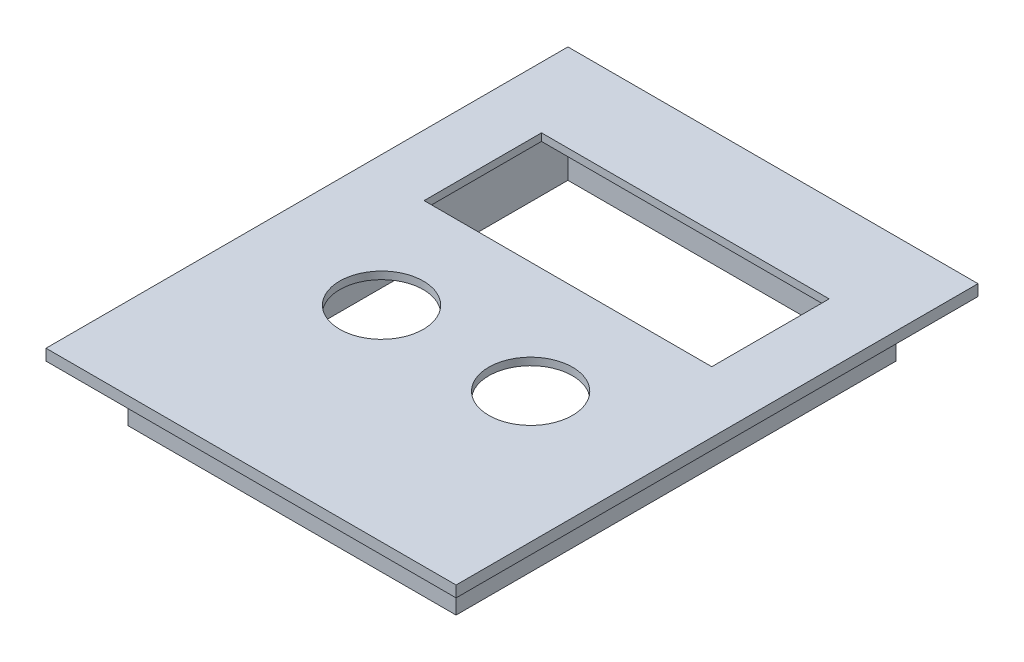
ISO-10303-21;
HEADER;
FILE_DESCRIPTION(('STEP AP214'),'2;1');
FILE_NAME('part.step','',(''),(''),'','','');
FILE_SCHEMA(('AUTOMOTIVE_DESIGN { 1 0 10303 214 1 1 1 1 }'));
ENDSEC;
DATA;
#1=APPLICATION_CONTEXT('core data for automotive mechanical design processes');
#2=APPLICATION_PROTOCOL_DEFINITION('international standard','automotive_design',2000,#1);
#3=PRODUCT_CONTEXT('',#1,'mechanical');
#4=PRODUCT('Part','Part','',(#3));
#5=PRODUCT_RELATED_PRODUCT_CATEGORY('part','',(#4));
#6=PRODUCT_DEFINITION_FORMATION('','',#4);
#7=PRODUCT_DEFINITION_CONTEXT('part definition',#1,'design');
#8=PRODUCT_DEFINITION('design','',#6,#7);
#9=PRODUCT_DEFINITION_SHAPE('','',#8);
#10=(LENGTH_UNIT() NAMED_UNIT(*) SI_UNIT(.MILLI.,.METRE.));
#11=(NAMED_UNIT(*) PLANE_ANGLE_UNIT() SI_UNIT($,.RADIAN.));
#12=(NAMED_UNIT(*) SI_UNIT($,.STERADIAN.) SOLID_ANGLE_UNIT());
#13=UNCERTAINTY_MEASURE_WITH_UNIT(LENGTH_MEASURE(1.E-05),#10,'distance_accuracy_value','');
#14=(GEOMETRIC_REPRESENTATION_CONTEXT(3) GLOBAL_UNCERTAINTY_ASSIGNED_CONTEXT((#13)) GLOBAL_UNIT_ASSIGNED_CONTEXT((#10,
#11,#12)) REPRESENTATION_CONTEXT('',''));
#15=CARTESIAN_POINT('',(0.,0.,0.));
#16=DIRECTION('',(0.,0.,1.));
#17=DIRECTION('',(1.,0.,0.));
#18=AXIS2_PLACEMENT_3D('',#15,#16,#17);
#19=CARTESIAN_POINT('',(0.,-19.05,0.));
#20=DIRECTION('',(0.,1.,0.));
#21=DIRECTION('',(0.,0.,1.));
#22=AXIS2_PLACEMENT_3D('',#19,#20,#21);
#23=PLANE('',#22);
#24=DIRECTION('',(0.,0.,1.));
#25=VECTOR('',#24,1.);
#26=CARTESIAN_POINT('',(55.88,-19.05,-74.93));
#27=LINE('',#26,#25);
#28=CARTESIAN_POINT('',(55.88,-19.05,-74.93));
#29=VERTEX_POINT('',#28);
#30=CARTESIAN_POINT('',(55.88,-19.05,74.93));
#31=VERTEX_POINT('',#30);
#32=EDGE_CURVE('E249',#29,#31,#27,.T.);
#33=ORIENTED_EDGE('',*,*,#32,.T.);
#34=DIRECTION('',(-1.,0.,0.));
#35=VECTOR('',#34,1.);
#36=CARTESIAN_POINT('',(-55.88,-19.05,74.93));
#37=LINE('',#36,#35);
#38=CARTESIAN_POINT('',(-55.88,-19.05,74.93));
#39=VERTEX_POINT('',#38);
#40=EDGE_CURVE('E253',#31,#39,#37,.T.);
#41=ORIENTED_EDGE('',*,*,#40,.T.);
#42=DIRECTION('',(0.,0.,-1.));
#43=VECTOR('',#42,1.);
#44=CARTESIAN_POINT('',(-55.88,-19.05,-74.93));
#45=LINE('',#44,#43);
#46=CARTESIAN_POINT('',(-55.88,-19.05,-74.93));
#47=VERTEX_POINT('',#46);
#48=EDGE_CURVE('E257',#39,#47,#45,.T.);
#49=ORIENTED_EDGE('',*,*,#48,.T.);
#50=DIRECTION('',(1.,0.,0.));
#51=VECTOR('',#50,1.);
#52=CARTESIAN_POINT('',(-55.88,-19.05,-74.93));
#53=LINE('',#52,#51);
#54=EDGE_CURVE('E260',#47,#29,#53,.T.);
#55=ORIENTED_EDGE('',*,*,#54,.T.);
#56=EDGE_LOOP('',(#33,#41,#49,#55));
#57=FACE_BOUND('',#56,.T.);
#58=DIRECTION('',(0.,0.,1.));
#59=VECTOR('',#58,1.);
#60=CARTESIAN_POINT('',(53.34,-19.05,0.));
#61=LINE('',#60,#59);
#62=CARTESIAN_POINT('',(53.34,-19.05,-72.39));
#63=VERTEX_POINT('',#62);
#64=CARTESIAN_POINT('',(53.34,-19.05,72.39));
#65=VERTEX_POINT('',#64);
#66=EDGE_CURVE('E221',#63,#65,#61,.T.);
#67=ORIENTED_EDGE('',*,*,#66,.F.);
#68=DIRECTION('',(1.,0.,0.));
#69=VECTOR('',#68,1.);
#70=CARTESIAN_POINT('',(0.,-19.05,-72.39));
#71=LINE('',#70,#69);
#72=CARTESIAN_POINT('',(-53.34,-19.05,-72.39));
#73=VERTEX_POINT('',#72);
#74=EDGE_CURVE('E214',#73,#63,#71,.T.);
#75=ORIENTED_EDGE('',*,*,#74,.F.);
#76=DIRECTION('',(0.,0.,-1.));
#77=VECTOR('',#76,1.);
#78=CARTESIAN_POINT('',(-53.34,-19.05,0.));
#79=LINE('',#78,#77);
#80=CARTESIAN_POINT('',(-53.34,-19.05,72.39));
#81=VERTEX_POINT('',#80);
#82=EDGE_CURVE('E228',#81,#73,#79,.T.);
#83=ORIENTED_EDGE('',*,*,#82,.F.);
#84=DIRECTION('',(-1.,0.,0.));
#85=VECTOR('',#84,1.);
#86=CARTESIAN_POINT('',(0.,-19.05,72.39));
#87=LINE('',#86,#85);
#88=EDGE_CURVE('E224',#65,#81,#87,.T.);
#89=ORIENTED_EDGE('',*,*,#88,.F.);
#90=EDGE_LOOP('',(#67,#75,#83,#89));
#91=FACE_BOUND('',#90,.T.);
#92=ADVANCED_FACE('F44',(#57,#91),#23,.F.);
#93=CARTESIAN_POINT('',(0.,0.,0.));
#94=DIRECTION('',(0.,1.,0.));
#95=DIRECTION('',(0.,0.,1.));
#96=AXIS2_PLACEMENT_3D('',#93,#94,#95);
#97=PLANE('',#96);
#98=DIRECTION('',(0.,0.,1.));
#99=VECTOR('',#98,1.);
#100=CARTESIAN_POINT('',(-69.85,0.,88.9));
#101=LINE('',#100,#99);
#102=CARTESIAN_POINT('',(-69.85,0.,-88.9));
#103=VERTEX_POINT('',#102);
#104=CARTESIAN_POINT('',(-69.85,0.,88.9));
#105=VERTEX_POINT('',#104);
#106=EDGE_CURVE('E293',#103,#105,#101,.T.);
#107=ORIENTED_EDGE('',*,*,#106,.F.);
#108=DIRECTION('',(-1.,0.,0.));
#109=VECTOR('',#108,1.);
#110=CARTESIAN_POINT('',(69.85,0.,-88.9));
#111=LINE('',#110,#109);
#112=CARTESIAN_POINT('',(69.85,0.,-88.9));
#113=VERTEX_POINT('',#112);
#114=EDGE_CURVE('E299',#113,#103,#111,.T.);
#115=ORIENTED_EDGE('',*,*,#114,.F.);
#116=DIRECTION('',(0.,0.,-1.));
#117=VECTOR('',#116,1.);
#118=CARTESIAN_POINT('',(69.85,0.,88.9));
#119=LINE('',#118,#117);
#120=CARTESIAN_POINT('',(69.85,0.,88.9));
#121=VERTEX_POINT('',#120);
#122=EDGE_CURVE('E315',#121,#113,#119,.T.);
#123=ORIENTED_EDGE('',*,*,#122,.F.);
#124=DIRECTION('',(1.,0.,0.));
#125=VECTOR('',#124,1.);
#126=CARTESIAN_POINT('',(69.85,0.,88.9));
#127=LINE('',#126,#125);
#128=EDGE_CURVE('E312',#105,#121,#127,.T.);
#129=ORIENTED_EDGE('',*,*,#128,.F.);
#130=EDGE_LOOP('',(#107,#115,#123,#129));
#131=FACE_BOUND('',#130,.T.);
#132=DIRECTION('',(0.,0.,1.));
#133=VECTOR('',#132,1.);
#134=CARTESIAN_POINT('',(55.88,0.,-74.93));
#135=LINE('',#134,#133);
#136=CARTESIAN_POINT('',(55.88,0.,-74.93));
#137=VERTEX_POINT('',#136);
#138=CARTESIAN_POINT('',(55.88,0.,74.93));
#139=VERTEX_POINT('',#138);
#140=EDGE_CURVE('E248',#137,#139,#135,.T.);
#141=ORIENTED_EDGE('',*,*,#140,.F.);
#142=DIRECTION('',(1.,0.,0.));
#143=VECTOR('',#142,1.);
#144=CARTESIAN_POINT('',(-55.88,0.,-74.93));
#145=LINE('',#144,#143);
#146=CARTESIAN_POINT('',(-55.88,0.,-74.93));
#147=VERTEX_POINT('',#146);
#148=EDGE_CURVE('E254',#147,#137,#145,.T.);
#149=ORIENTED_EDGE('',*,*,#148,.F.);
#150=DIRECTION('',(0.,0.,-1.));
#151=VECTOR('',#150,1.);
#152=CARTESIAN_POINT('',(-55.88,0.,-74.93));
#153=LINE('',#152,#151);
#154=CARTESIAN_POINT('',(-55.88,0.,74.93));
#155=VERTEX_POINT('',#154);
#156=EDGE_CURVE('E271',#155,#147,#153,.T.);
#157=ORIENTED_EDGE('',*,*,#156,.F.);
#158=DIRECTION('',(-1.,0.,0.));
#159=VECTOR('',#158,1.);
#160=CARTESIAN_POINT('',(-55.88,0.,74.93));
#161=LINE('',#160,#159);
#162=EDGE_CURVE('E267',#139,#155,#161,.T.);
#163=ORIENTED_EDGE('',*,*,#162,.F.);
#164=EDGE_LOOP('',(#141,#149,#157,#163));
#165=FACE_BOUND('',#164,.T.);
#166=ADVANCED_FACE('F410',(#131,#165),#97,.F.);
#167=CARTESIAN_POINT('',(-69.85,3.81,88.9));
#168=DIRECTION('',(1.,0.,0.));
#169=DIRECTION('',(0.,0.,-1.));
#170=AXIS2_PLACEMENT_3D('',#167,#168,#169);
#171=PLANE('',#170);
#172=ORIENTED_EDGE('',*,*,#106,.T.);
#173=DIRECTION('',(0.,-1.,0.));
#174=VECTOR('',#173,1.);
#175=CARTESIAN_POINT('',(-69.85,3.81,88.9));
#176=LINE('',#175,#174);
#177=CARTESIAN_POINT('',(-69.85,3.81,88.9));
#178=VERTEX_POINT('',#177);
#179=EDGE_CURVE('E331',#178,#105,#176,.T.);
#180=ORIENTED_EDGE('',*,*,#179,.F.);
#181=DIRECTION('',(0.,0.,1.));
#182=VECTOR('',#181,1.);
#183=CARTESIAN_POINT('',(-69.85,3.81,88.9));
#184=LINE('',#183,#182);
#185=CARTESIAN_POINT('',(-69.85,3.81,-88.9));
#186=VERTEX_POINT('',#185);
#187=EDGE_CURVE('E294',#186,#178,#184,.T.);
#188=ORIENTED_EDGE('',*,*,#187,.F.);
#189=DIRECTION('',(0.,-1.,0.));
#190=VECTOR('',#189,1.);
#191=CARTESIAN_POINT('',(-69.85,3.81,-88.9));
#192=LINE('',#191,#190);
#193=EDGE_CURVE('E308',#186,#103,#192,.T.);
#194=ORIENTED_EDGE('',*,*,#193,.T.);
#195=EDGE_LOOP('',(#172,#180,#188,#194));
#196=FACE_BOUND('',#195,.T.);
#197=ADVANCED_FACE('F46',(#196),#171,.F.);
#198=CARTESIAN_POINT('',(69.85,3.81,88.9));
#199=DIRECTION('',(0.,0.,-1.));
#200=DIRECTION('',(-1.,0.,0.));
#201=AXIS2_PLACEMENT_3D('',#198,#199,#200);
#202=PLANE('',#201);
#203=ORIENTED_EDGE('',*,*,#128,.T.);
#204=DIRECTION('',(0.,-1.,0.));
#205=VECTOR('',#204,1.);
#206=CARTESIAN_POINT('',(69.85,3.81,88.9));
#207=LINE('',#206,#205);
#208=CARTESIAN_POINT('',(69.85,3.81,88.9));
#209=VERTEX_POINT('',#208);
#210=EDGE_CURVE('E327',#209,#121,#207,.T.);
#211=ORIENTED_EDGE('',*,*,#210,.F.);
#212=DIRECTION('',(1.,0.,0.));
#213=VECTOR('',#212,1.);
#214=CARTESIAN_POINT('',(69.85,3.81,88.9));
#215=LINE('',#214,#213);
#216=EDGE_CURVE('E298',#178,#209,#215,.T.);
#217=ORIENTED_EDGE('',*,*,#216,.F.);
#218=ORIENTED_EDGE('',*,*,#179,.T.);
#219=EDGE_LOOP('',(#203,#211,#217,#218));
#220=FACE_BOUND('',#219,.T.);
#221=ADVANCED_FACE('F444',(#220),#202,.F.);
#222=CARTESIAN_POINT('',(69.85,3.81,88.9));
#223=DIRECTION('',(-1.,0.,0.));
#224=DIRECTION('',(0.,0.,1.));
#225=AXIS2_PLACEMENT_3D('',#222,#223,#224);
#226=PLANE('',#225);
#227=ORIENTED_EDGE('',*,*,#122,.T.);
#228=DIRECTION('',(0.,-1.,0.));
#229=VECTOR('',#228,1.);
#230=CARTESIAN_POINT('',(69.85,3.81,-88.9));
#231=LINE('',#230,#229);
#232=CARTESIAN_POINT('',(69.85,3.81,-88.9));
#233=VERTEX_POINT('',#232);
#234=EDGE_CURVE('E323',#233,#113,#231,.T.);
#235=ORIENTED_EDGE('',*,*,#234,.F.);
#236=DIRECTION('',(0.,0.,-1.));
#237=VECTOR('',#236,1.);
#238=CARTESIAN_POINT('',(69.85,3.81,88.9));
#239=LINE('',#238,#237);
#240=EDGE_CURVE('E302',#209,#233,#239,.T.);
#241=ORIENTED_EDGE('',*,*,#240,.F.);
#242=ORIENTED_EDGE('',*,*,#210,.T.);
#243=EDGE_LOOP('',(#227,#235,#241,#242));
#244=FACE_BOUND('',#243,.T.);
#245=ADVANCED_FACE('F441',(#244),#226,.F.);
#246=CARTESIAN_POINT('',(69.85,3.81,-88.9));
#247=DIRECTION('',(0.,0.,1.));
#248=DIRECTION('',(1.,0.,0.));
#249=AXIS2_PLACEMENT_3D('',#246,#247,#248);
#250=PLANE('',#249);
#251=ORIENTED_EDGE('',*,*,#114,.T.);
#252=ORIENTED_EDGE('',*,*,#193,.F.);
#253=DIRECTION('',(-1.,0.,0.));
#254=VECTOR('',#253,1.);
#255=CARTESIAN_POINT('',(69.85,3.81,-88.9));
#256=LINE('',#255,#254);
#257=EDGE_CURVE('E305',#233,#186,#256,.T.);
#258=ORIENTED_EDGE('',*,*,#257,.F.);
#259=ORIENTED_EDGE('',*,*,#234,.T.);
#260=EDGE_LOOP('',(#251,#252,#258,#259));
#261=FACE_BOUND('',#260,.T.);
#262=ADVANCED_FACE('F437',(#261),#250,.F.);
#263=CARTESIAN_POINT('',(0.,3.81,0.));
#264=DIRECTION('',(0.,1.,0.));
#265=DIRECTION('',(0.,0.,1.));
#266=AXIS2_PLACEMENT_3D('',#263,#264,#265);
#267=PLANE('',#266);
#268=DIRECTION('',(0.,0.,1.));
#269=VECTOR('',#268,1.);
#270=CARTESIAN_POINT('',(-49.,3.81,-19.05));
#271=LINE('',#270,#269);
#272=CARTESIAN_POINT('',(-49.,3.81,-59.05));
#273=VERTEX_POINT('',#272);
#274=CARTESIAN_POINT('',(-49.,3.81,-19.05));
#275=VERTEX_POINT('',#274);
#276=EDGE_CURVE('E60',#273,#275,#271,.T.);
#277=ORIENTED_EDGE('',*,*,#276,.F.);
#278=DIRECTION('',(-1.,0.,0.));
#279=VECTOR('',#278,1.);
#280=CARTESIAN_POINT('',(49.,3.81,-59.05));
#281=LINE('',#280,#279);
#282=CARTESIAN_POINT('',(49.,3.81,-59.05));
#283=VERTEX_POINT('',#282);
#284=EDGE_CURVE('E179',#283,#273,#281,.T.);
#285=ORIENTED_EDGE('',*,*,#284,.F.);
#286=DIRECTION('',(0.,0.,-1.));
#287=VECTOR('',#286,1.);
#288=CARTESIAN_POINT('',(49.,3.81,-19.05));
#289=LINE('',#288,#287);
#290=CARTESIAN_POINT('',(49.,3.81,-19.05));
#291=VERTEX_POINT('',#290);
#292=EDGE_CURVE('E161',#291,#283,#289,.T.);
#293=ORIENTED_EDGE('',*,*,#292,.F.);
#294=DIRECTION('',(1.,0.,0.));
#295=VECTOR('',#294,1.);
#296=CARTESIAN_POINT('',(49.,3.81,-19.05));
#297=LINE('',#296,#295);
#298=EDGE_CURVE('E171',#275,#291,#297,.T.);
#299=ORIENTED_EDGE('',*,*,#298,.F.);
#300=EDGE_LOOP('',(#277,#285,#293,#299));
#301=FACE_BOUND('',#300,.T.);
#302=CARTESIAN_POINT('',(-25.4,3.81,19.05));
#303=DIRECTION('',(0.,1.,0.));
#304=DIRECTION('',(0.,0.,1.));
#305=AXIS2_PLACEMENT_3D('',#302,#303,#304);
#306=CIRCLE('',#305,14.25);
#307=CARTESIAN_POINT('',(-25.4,3.81,33.3));
#308=VERTEX_POINT('',#307);
#309=EDGE_CURVE('E194',#308,#308,#306,.T.);
#310=ORIENTED_EDGE('',*,*,#309,.F.);
#311=EDGE_LOOP('',(#310));
#312=FACE_BOUND('',#311,.T.);
#313=CARTESIAN_POINT('',(25.4,3.81,19.05));
#314=DIRECTION('',(0.,1.,0.));
#315=DIRECTION('',(0.,0.,1.));
#316=AXIS2_PLACEMENT_3D('',#313,#314,#315);
#317=CIRCLE('',#316,14.25);
#318=CARTESIAN_POINT('',(25.4,3.81,33.3));
#319=VERTEX_POINT('',#318);
#320=EDGE_CURVE('E198',#319,#319,#317,.T.);
#321=ORIENTED_EDGE('',*,*,#320,.F.);
#322=EDGE_LOOP('',(#321));
#323=FACE_BOUND('',#322,.T.);
#324=ORIENTED_EDGE('',*,*,#187,.T.);
#325=ORIENTED_EDGE('',*,*,#216,.T.);
#326=ORIENTED_EDGE('',*,*,#240,.T.);
#327=ORIENTED_EDGE('',*,*,#257,.T.);
#328=EDGE_LOOP('',(#324,#325,#326,#327));
#329=FACE_BOUND('',#328,.T.);
#330=ADVANCED_FACE('F176',(#301,#312,#323,#329),#267,.T.);
#331=CARTESIAN_POINT('',(55.88,-19.05,-74.93));
#332=DIRECTION('',(-1.,0.,0.));
#333=DIRECTION('',(0.,0.,1.));
#334=AXIS2_PLACEMENT_3D('',#331,#332,#333);
#335=PLANE('',#334);
#336=ORIENTED_EDGE('',*,*,#140,.T.);
#337=DIRECTION('',(0.,1.,0.));
#338=VECTOR('',#337,1.);
#339=CARTESIAN_POINT('',(55.88,-19.05,74.93));
#340=LINE('',#339,#338);
#341=EDGE_CURVE('E289',#31,#139,#340,.T.);
#342=ORIENTED_EDGE('',*,*,#341,.F.);
#343=ORIENTED_EDGE('',*,*,#32,.F.);
#344=DIRECTION('',(0.,1.,0.));
#345=VECTOR('',#344,1.);
#346=CARTESIAN_POINT('',(55.88,-19.05,-74.93));
#347=LINE('',#346,#345);
#348=EDGE_CURVE('E263',#29,#137,#347,.T.);
#349=ORIENTED_EDGE('',*,*,#348,.T.);
#350=EDGE_LOOP('',(#336,#342,#343,#349));
#351=FACE_BOUND('',#350,.T.);
#352=ADVANCED_FACE('F432',(#351),#335,.F.);
#353=CARTESIAN_POINT('',(-55.88,-19.05,74.93));
#354=DIRECTION('',(0.,0.,-1.));
#355=DIRECTION('',(-1.,0.,0.));
#356=AXIS2_PLACEMENT_3D('',#353,#354,#355);
#357=PLANE('',#356);
#358=ORIENTED_EDGE('',*,*,#162,.T.);
#359=DIRECTION('',(0.,1.,0.));
#360=VECTOR('',#359,1.);
#361=CARTESIAN_POINT('',(-55.88,-19.05,74.93));
#362=LINE('',#361,#360);
#363=EDGE_CURVE('E285',#39,#155,#362,.T.);
#364=ORIENTED_EDGE('',*,*,#363,.F.);
#365=ORIENTED_EDGE('',*,*,#40,.F.);
#366=ORIENTED_EDGE('',*,*,#341,.T.);
#367=EDGE_LOOP('',(#358,#364,#365,#366));
#368=FACE_BOUND('',#367,.T.);
#369=ADVANCED_FACE('F428',(#368),#357,.F.);
#370=CARTESIAN_POINT('',(-55.88,-19.05,-74.93));
#371=DIRECTION('',(1.,0.,0.));
#372=DIRECTION('',(0.,0.,-1.));
#373=AXIS2_PLACEMENT_3D('',#370,#371,#372);
#374=PLANE('',#373);
#375=ORIENTED_EDGE('',*,*,#156,.T.);
#376=DIRECTION('',(0.,1.,0.));
#377=VECTOR('',#376,1.);
#378=CARTESIAN_POINT('',(-55.88,-19.05,-74.93));
#379=LINE('',#378,#377);
#380=EDGE_CURVE('E281',#47,#147,#379,.T.);
#381=ORIENTED_EDGE('',*,*,#380,.F.);
#382=ORIENTED_EDGE('',*,*,#48,.F.);
#383=ORIENTED_EDGE('',*,*,#363,.T.);
#384=EDGE_LOOP('',(#375,#381,#382,#383));
#385=FACE_BOUND('',#384,.T.);
#386=ADVANCED_FACE('F424',(#385),#374,.F.);
#387=CARTESIAN_POINT('',(-55.88,-19.05,-74.93));
#388=DIRECTION('',(0.,0.,1.));
#389=DIRECTION('',(1.,0.,0.));
#390=AXIS2_PLACEMENT_3D('',#387,#388,#389);
#391=PLANE('',#390);
#392=ORIENTED_EDGE('',*,*,#148,.T.);
#393=ORIENTED_EDGE('',*,*,#348,.F.);
#394=ORIENTED_EDGE('',*,*,#54,.F.);
#395=ORIENTED_EDGE('',*,*,#380,.T.);
#396=EDGE_LOOP('',(#392,#393,#394,#395));
#397=FACE_BOUND('',#396,.T.);
#398=ADVANCED_FACE('F422',(#397),#391,.F.);
#399=CARTESIAN_POINT('',(-55.88,-19.05,72.39));
#400=DIRECTION('',(0.,0.,-1.));
#401=DIRECTION('',(-1.,0.,0.));
#402=AXIS2_PLACEMENT_3D('',#399,#400,#401);
#403=PLANE('',#402);
#404=DIRECTION('',(0.,1.,0.));
#405=VECTOR('',#404,1.);
#406=CARTESIAN_POINT('',(53.34,-19.05,72.39));
#407=LINE('',#406,#405);
#408=CARTESIAN_POINT('',(53.34,1.27,72.39));
#409=VERTEX_POINT('',#408);
#410=EDGE_CURVE('E203',#65,#409,#407,.T.);
#411=ORIENTED_EDGE('',*,*,#410,.F.);
#412=ORIENTED_EDGE('',*,*,#88,.T.);
#413=DIRECTION('',(0.,1.,0.));
#414=VECTOR('',#413,1.);
#415=CARTESIAN_POINT('',(-53.34,-19.05,72.39));
#416=LINE('',#415,#414);
#417=CARTESIAN_POINT('',(-53.34,1.27,72.39));
#418=VERTEX_POINT('',#417);
#419=EDGE_CURVE('E208',#81,#418,#416,.T.);
#420=ORIENTED_EDGE('',*,*,#419,.T.);
#421=DIRECTION('',(-1.,0.,0.));
#422=VECTOR('',#421,1.);
#423=CARTESIAN_POINT('',(0.,1.27,72.39));
#424=LINE('',#423,#422);
#425=EDGE_CURVE('E244',#409,#418,#424,.T.);
#426=ORIENTED_EDGE('',*,*,#425,.F.);
#427=EDGE_LOOP('',(#411,#412,#420,#426));
#428=FACE_BOUND('',#427,.T.);
#429=ADVANCED_FACE('F389',(#428),#403,.T.);
#430=CARTESIAN_POINT('',(-53.34,-19.05,-74.93));
#431=DIRECTION('',(1.,0.,0.));
#432=DIRECTION('',(0.,0.,-1.));
#433=AXIS2_PLACEMENT_3D('',#430,#431,#432);
#434=PLANE('',#433);
#435=ORIENTED_EDGE('',*,*,#419,.F.);
#436=ORIENTED_EDGE('',*,*,#82,.T.);
#437=DIRECTION('',(0.,1.,0.));
#438=VECTOR('',#437,1.);
#439=CARTESIAN_POINT('',(-53.34,-19.05,-72.39));
#440=LINE('',#439,#438);
#441=CARTESIAN_POINT('',(-53.34,1.27,-72.39));
#442=VERTEX_POINT('',#441);
#443=EDGE_CURVE('E213',#73,#442,#440,.T.);
#444=ORIENTED_EDGE('',*,*,#443,.T.);
#445=DIRECTION('',(0.,0.,-1.));
#446=VECTOR('',#445,1.);
#447=CARTESIAN_POINT('',(-53.34,1.27,0.));
#448=LINE('',#447,#446);
#449=EDGE_CURVE('E240',#418,#442,#448,.T.);
#450=ORIENTED_EDGE('',*,*,#449,.F.);
#451=EDGE_LOOP('',(#435,#436,#444,#450));
#452=FACE_BOUND('',#451,.T.);
#453=ADVANCED_FACE('F393',(#452),#434,.T.);
#454=CARTESIAN_POINT('',(-55.88,-19.05,-72.39));
#455=DIRECTION('',(0.,0.,1.));
#456=DIRECTION('',(1.,0.,0.));
#457=AXIS2_PLACEMENT_3D('',#454,#455,#456);
#458=PLANE('',#457);
#459=ORIENTED_EDGE('',*,*,#443,.F.);
#460=ORIENTED_EDGE('',*,*,#74,.T.);
#461=DIRECTION('',(0.,1.,0.));
#462=VECTOR('',#461,1.);
#463=CARTESIAN_POINT('',(53.34,-19.05,-72.39));
#464=LINE('',#463,#462);
#465=CARTESIAN_POINT('',(53.34,1.27,-72.39));
#466=VERTEX_POINT('',#465);
#467=EDGE_CURVE('E209',#63,#466,#464,.T.);
#468=ORIENTED_EDGE('',*,*,#467,.T.);
#469=DIRECTION('',(1.,0.,0.));
#470=VECTOR('',#469,1.);
#471=CARTESIAN_POINT('',(0.,1.27,-72.39));
#472=LINE('',#471,#470);
#473=EDGE_CURVE('E237',#442,#466,#472,.T.);
#474=ORIENTED_EDGE('',*,*,#473,.F.);
#475=EDGE_LOOP('',(#459,#460,#468,#474));
#476=FACE_BOUND('',#475,.T.);
#477=ADVANCED_FACE('F399',(#476),#458,.T.);
#478=CARTESIAN_POINT('',(53.34,-19.05,-74.93));
#479=DIRECTION('',(-1.,0.,0.));
#480=DIRECTION('',(0.,0.,1.));
#481=AXIS2_PLACEMENT_3D('',#478,#479,#480);
#482=PLANE('',#481);
#483=ORIENTED_EDGE('',*,*,#467,.F.);
#484=ORIENTED_EDGE('',*,*,#66,.T.);
#485=ORIENTED_EDGE('',*,*,#410,.T.);
#486=DIRECTION('',(0.,0.,1.));
#487=VECTOR('',#486,1.);
#488=CARTESIAN_POINT('',(53.34,1.27,0.));
#489=LINE('',#488,#487);
#490=EDGE_CURVE('E207',#466,#409,#489,.T.);
#491=ORIENTED_EDGE('',*,*,#490,.F.);
#492=EDGE_LOOP('',(#483,#484,#485,#491));
#493=FACE_BOUND('',#492,.T.);
#494=ADVANCED_FACE('F371',(#493),#482,.T.);
#495=CARTESIAN_POINT('',(0.,1.27,0.));
#496=DIRECTION('',(0.,1.,0.));
#497=DIRECTION('',(0.,0.,1.));
#498=AXIS2_PLACEMENT_3D('',#495,#496,#497);
#499=PLANE('',#498);
#500=CARTESIAN_POINT('',(-46.5,1.27,-66.55));
#501=DIRECTION('',(0.,1.,0.));
#502=DIRECTION('',(0.,0.,1.));
#503=AXIS2_PLACEMENT_3D('',#500,#501,#502);
#504=CIRCLE('',#503,3.);
#505=CARTESIAN_POINT('',(-46.5,1.27,-63.55));
#506=VERTEX_POINT('',#505);
#507=EDGE_CURVE('E11',#506,#506,#504,.F.);
#508=ORIENTED_EDGE('',*,*,#507,.F.);
#509=EDGE_LOOP('',(#508));
#510=FACE_BOUND('',#509,.T.);
#511=CARTESIAN_POINT('',(46.5,1.27,-66.55));
#512=DIRECTION('',(0.,1.,0.));
#513=DIRECTION('',(0.,0.,1.));
#514=AXIS2_PLACEMENT_3D('',#511,#512,#513);
#515=CIRCLE('',#514,3.);
#516=CARTESIAN_POINT('',(46.5,1.27,-63.55));
#517=VERTEX_POINT('',#516);
#518=EDGE_CURVE('E53',#517,#517,#515,.F.);
#519=ORIENTED_EDGE('',*,*,#518,.F.);
#520=EDGE_LOOP('',(#519));
#521=FACE_BOUND('',#520,.T.);
#522=CARTESIAN_POINT('',(46.5,1.27,-11.55));
#523=DIRECTION('',(0.,1.,0.));
#524=DIRECTION('',(0.,0.,1.));
#525=AXIS2_PLACEMENT_3D('',#522,#523,#524);
#526=CIRCLE('',#525,3.);
#527=CARTESIAN_POINT('',(46.5,1.27,-8.55));
#528=VERTEX_POINT('',#527);
#529=EDGE_CURVE('E358',#528,#528,#526,.F.);
#530=ORIENTED_EDGE('',*,*,#529,.F.);
#531=EDGE_LOOP('',(#530));
#532=FACE_BOUND('',#531,.T.);
#533=CARTESIAN_POINT('',(-46.5,1.27,-11.55));
#534=DIRECTION('',(0.,1.,0.));
#535=DIRECTION('',(0.,0.,1.));
#536=AXIS2_PLACEMENT_3D('',#533,#534,#535);
#537=CIRCLE('',#536,3.);
#538=CARTESIAN_POINT('',(-46.5,1.27,-8.55000000000001));
#539=VERTEX_POINT('',#538);
#540=EDGE_CURVE('E354',#539,#539,#537,.F.);
#541=ORIENTED_EDGE('',*,*,#540,.F.);
#542=EDGE_LOOP('',(#541));
#543=FACE_BOUND('',#542,.T.);
#544=DIRECTION('',(-1.,0.,0.));
#545=VECTOR('',#544,1.);
#546=CARTESIAN_POINT('',(0.,1.27,-59.05));
#547=LINE('',#546,#545);
#548=CARTESIAN_POINT('',(49.,1.27,-59.05));
#549=VERTEX_POINT('',#548);
#550=CARTESIAN_POINT('',(-49.,1.27,-59.05));
#551=VERTEX_POINT('',#550);
#552=EDGE_CURVE('E346',#549,#551,#547,.T.);
#553=ORIENTED_EDGE('',*,*,#552,.T.);
#554=DIRECTION('',(0.,0.,1.));
#555=VECTOR('',#554,1.);
#556=CARTESIAN_POINT('',(-49.,1.27,0.));
#557=LINE('',#556,#555);
#558=CARTESIAN_POINT('',(-49.,1.27,-19.05));
#559=VERTEX_POINT('',#558);
#560=EDGE_CURVE('E350',#551,#559,#557,.T.);
#561=ORIENTED_EDGE('',*,*,#560,.T.);
#562=DIRECTION('',(1.,0.,0.));
#563=VECTOR('',#562,1.);
#564=CARTESIAN_POINT('',(0.,1.27,-19.05));
#565=LINE('',#564,#563);
#566=CARTESIAN_POINT('',(49.,1.27,-19.05));
#567=VERTEX_POINT('',#566);
#568=EDGE_CURVE('E335',#559,#567,#565,.T.);
#569=ORIENTED_EDGE('',*,*,#568,.T.);
#570=DIRECTION('',(0.,0.,-1.));
#571=VECTOR('',#570,1.);
#572=CARTESIAN_POINT('',(49.,1.27,0.));
#573=LINE('',#572,#571);
#574=EDGE_CURVE('E164',#567,#549,#573,.T.);
#575=ORIENTED_EDGE('',*,*,#574,.T.);
#576=EDGE_LOOP('',(#553,#561,#569,#575));
#577=FACE_BOUND('',#576,.T.);
#578=CARTESIAN_POINT('',(-25.4,1.27,19.05));
#579=DIRECTION('',(0.,1.,0.));
#580=DIRECTION('',(0.,0.,1.));
#581=AXIS2_PLACEMENT_3D('',#578,#579,#580);
#582=CIRCLE('',#581,14.25);
#583=CARTESIAN_POINT('',(-25.4,1.27,33.3));
#584=VERTEX_POINT('',#583);
#585=EDGE_CURVE('E225',#584,#584,#582,.T.);
#586=ORIENTED_EDGE('',*,*,#585,.T.);
#587=EDGE_LOOP('',(#586));
#588=FACE_BOUND('',#587,.T.);
#589=CARTESIAN_POINT('',(25.4,1.27,19.05));
#590=DIRECTION('',(0.,1.,0.));
#591=DIRECTION('',(0.,0.,1.));
#592=AXIS2_PLACEMENT_3D('',#589,#590,#591);
#593=CIRCLE('',#592,14.25);
#594=CARTESIAN_POINT('',(25.4,1.27,33.3));
#595=VERTEX_POINT('',#594);
#596=EDGE_CURVE('E189',#595,#595,#593,.T.);
#597=ORIENTED_EDGE('',*,*,#596,.T.);
#598=EDGE_LOOP('',(#597));
#599=FACE_BOUND('',#598,.T.);
#600=ORIENTED_EDGE('',*,*,#425,.T.);
#601=ORIENTED_EDGE('',*,*,#449,.T.);
#602=ORIENTED_EDGE('',*,*,#473,.T.);
#603=ORIENTED_EDGE('',*,*,#490,.T.);
#604=EDGE_LOOP('',(#600,#601,#602,#603));
#605=FACE_BOUND('',#604,.T.);
#606=ADVANCED_FACE('F367',(#510,#521,#532,#543,#577,#588,#599,#605),#499,.F.);
#607=CARTESIAN_POINT('',(25.4,-19.05,19.05));
#608=DIRECTION('',(0.,1.,0.));
#609=DIRECTION('',(0.,0.,1.));
#610=AXIS2_PLACEMENT_3D('',#607,#608,#609);
#611=CYLINDRICAL_SURFACE('',#610,14.25);
#612=ORIENTED_EDGE('',*,*,#320,.T.);
#613=EDGE_LOOP('',(#612));
#614=FACE_BOUND('',#613,.T.);
#615=ORIENTED_EDGE('',*,*,#596,.F.);
#616=EDGE_LOOP('',(#615));
#617=FACE_BOUND('',#616,.T.);
#618=ADVANCED_FACE('F370',(#614,#617),#611,.F.);
#619=CARTESIAN_POINT('',(-25.4,-19.05,19.05));
#620=DIRECTION('',(0.,1.,0.));
#621=DIRECTION('',(0.,0.,1.));
#622=AXIS2_PLACEMENT_3D('',#619,#620,#621);
#623=CYLINDRICAL_SURFACE('',#622,14.25);
#624=ORIENTED_EDGE('',*,*,#309,.T.);
#625=EDGE_LOOP('',(#624));
#626=FACE_BOUND('',#625,.T.);
#627=ORIENTED_EDGE('',*,*,#585,.F.);
#628=EDGE_LOOP('',(#627));
#629=FACE_BOUND('',#628,.T.);
#630=ADVANCED_FACE('F569',(#626,#629),#623,.F.);
#631=CARTESIAN_POINT('',(-49.,-19.05,-19.05));
#632=DIRECTION('',(-1.,0.,0.));
#633=DIRECTION('',(0.,0.,1.));
#634=AXIS2_PLACEMENT_3D('',#631,#632,#633);
#635=PLANE('',#634);
#636=DIRECTION('',(0.,1.,0.));
#637=VECTOR('',#636,1.);
#638=CARTESIAN_POINT('',(-49.,-19.05,-59.05));
#639=LINE('',#638,#637);
#640=EDGE_CURVE('E186',#551,#273,#639,.T.);
#641=ORIENTED_EDGE('',*,*,#640,.T.);
#642=ORIENTED_EDGE('',*,*,#276,.T.);
#643=DIRECTION('',(0.,1.,0.));
#644=VECTOR('',#643,1.);
#645=CARTESIAN_POINT('',(-49.,-19.05,-19.05));
#646=LINE('',#645,#644);
#647=EDGE_CURVE('E168',#559,#275,#646,.T.);
#648=ORIENTED_EDGE('',*,*,#647,.F.);
#649=ORIENTED_EDGE('',*,*,#560,.F.);
#650=EDGE_LOOP('',(#641,#642,#648,#649));
#651=FACE_BOUND('',#650,.T.);
#652=ADVANCED_FACE('F579',(#651),#635,.F.);
#653=CARTESIAN_POINT('',(49.,-19.05,-59.05));
#654=DIRECTION('',(0.,0.,-1.));
#655=DIRECTION('',(-1.,0.,0.));
#656=AXIS2_PLACEMENT_3D('',#653,#654,#655);
#657=PLANE('',#656);
#658=DIRECTION('',(0.,1.,0.));
#659=VECTOR('',#658,1.);
#660=CARTESIAN_POINT('',(49.,-19.05,-59.05));
#661=LINE('',#660,#659);
#662=EDGE_CURVE('E167',#549,#283,#661,.T.);
#663=ORIENTED_EDGE('',*,*,#662,.T.);
#664=ORIENTED_EDGE('',*,*,#284,.T.);
#665=ORIENTED_EDGE('',*,*,#640,.F.);
#666=ORIENTED_EDGE('',*,*,#552,.F.);
#667=EDGE_LOOP('',(#663,#664,#665,#666));
#668=FACE_BOUND('',#667,.T.);
#669=ADVANCED_FACE('F589',(#668),#657,.F.);
#670=CARTESIAN_POINT('',(49.,-19.05,-19.05));
#671=DIRECTION('',(1.,0.,0.));
#672=DIRECTION('',(0.,0.,-1.));
#673=AXIS2_PLACEMENT_3D('',#670,#671,#672);
#674=PLANE('',#673);
#675=DIRECTION('',(0.,1.,0.));
#676=VECTOR('',#675,1.);
#677=CARTESIAN_POINT('',(49.,-19.05,-19.05));
#678=LINE('',#677,#676);
#679=EDGE_CURVE('E68',#567,#291,#678,.T.);
#680=ORIENTED_EDGE('',*,*,#679,.T.);
#681=ORIENTED_EDGE('',*,*,#292,.T.);
#682=ORIENTED_EDGE('',*,*,#662,.F.);
#683=ORIENTED_EDGE('',*,*,#574,.F.);
#684=EDGE_LOOP('',(#680,#681,#682,#683));
#685=FACE_BOUND('',#684,.T.);
#686=ADVANCED_FACE('F158',(#685),#674,.F.);
#687=CARTESIAN_POINT('',(49.,-19.05,-19.05));
#688=DIRECTION('',(0.,0.,1.));
#689=DIRECTION('',(1.,0.,0.));
#690=AXIS2_PLACEMENT_3D('',#687,#688,#689);
#691=PLANE('',#690);
#692=ORIENTED_EDGE('',*,*,#647,.T.);
#693=ORIENTED_EDGE('',*,*,#298,.T.);
#694=ORIENTED_EDGE('',*,*,#679,.F.);
#695=ORIENTED_EDGE('',*,*,#568,.F.);
#696=EDGE_LOOP('',(#692,#693,#694,#695));
#697=FACE_BOUND('',#696,.T.);
#698=ADVANCED_FACE('F172',(#697),#691,.F.);
#699=CARTESIAN_POINT('',(-46.5,-1.27,-11.55));
#700=DIRECTION('',(0.,-1.,0.));
#701=DIRECTION('',(0.,0.,-1.));
#702=AXIS2_PLACEMENT_3D('',#699,#700,#701);
#703=PLANE('',#702);
#704=CARTESIAN_POINT('',(-46.5,-1.27,-11.55));
#705=DIRECTION('',(0.,-1.,0.));
#706=DIRECTION('',(0.,0.,-1.));
#707=AXIS2_PLACEMENT_3D('',#704,#705,#706);
#708=CIRCLE('',#707,3.);
#709=CARTESIAN_POINT('',(-46.5,-1.27,-14.55));
#710=VERTEX_POINT('',#709);
#711=EDGE_CURVE('E202',#710,#710,#708,.T.);
#712=ORIENTED_EDGE('',*,*,#711,.T.);
#713=EDGE_LOOP('',(#712));
#714=FACE_BOUND('',#713,.T.);
#715=CARTESIAN_POINT('',(-46.5,-1.27,-11.55));
#716=DIRECTION('',(0.,-1.,0.));
#717=DIRECTION('',(0.,0.,-1.));
#718=AXIS2_PLACEMENT_3D('',#715,#716,#717);
#719=CIRCLE('',#718,1.25);
#720=CARTESIAN_POINT('',(-46.5,-1.27,-12.8));
#721=VERTEX_POINT('',#720);
#722=EDGE_CURVE('E788',#721,#721,#719,.T.);
#723=ORIENTED_EDGE('',*,*,#722,.F.);
#724=EDGE_LOOP('',(#723));
#725=FACE_BOUND('',#724,.T.);
#726=ADVANCED_FACE('F614',(#714,#725),#703,.T.);
#727=CARTESIAN_POINT('',(-46.5,-1.27,-11.55));
#728=DIRECTION('',(0.,1.,0.));
#729=DIRECTION('',(0.,0.,1.));
#730=AXIS2_PLACEMENT_3D('',#727,#728,#729);
#731=CYLINDRICAL_SURFACE('',#730,3.);
#732=ORIENTED_EDGE('',*,*,#711,.F.);
#733=EDGE_LOOP('',(#732));
#734=FACE_BOUND('',#733,.T.);
#735=ORIENTED_EDGE('',*,*,#540,.T.);
#736=EDGE_LOOP('',(#735));
#737=FACE_BOUND('',#736,.T.);
#738=ADVANCED_FACE('F653',(#734,#737),#731,.T.);
#739=CARTESIAN_POINT('',(-46.5,-1.27,-11.55));
#740=DIRECTION('',(0.,1.,0.));
#741=DIRECTION('',(0.,0.,1.));
#742=AXIS2_PLACEMENT_3D('',#739,#740,#741);
#743=CYLINDRICAL_SURFACE('',#742,1.25);
#744=ORIENTED_EDGE('',*,*,#722,.T.);
#745=EDGE_LOOP('',(#744));
#746=FACE_BOUND('',#745,.T.);
#747=CARTESIAN_POINT('',(-46.5,1.27,-11.55));
#748=DIRECTION('',(0.,-1.,0.));
#749=DIRECTION('',(0.,0.,-1.));
#750=AXIS2_PLACEMENT_3D('',#747,#748,#749);
#751=CIRCLE('',#750,1.25);
#752=CARTESIAN_POINT('',(-46.5,1.27,-12.8));
#753=VERTEX_POINT('',#752);
#754=EDGE_CURVE('E792',#753,#753,#751,.T.);
#755=ORIENTED_EDGE('',*,*,#754,.F.);
#756=EDGE_LOOP('',(#755));
#757=FACE_BOUND('',#756,.T.);
#758=ADVANCED_FACE('F663',(#746,#757),#743,.F.);
#759=CARTESIAN_POINT('',(46.5,-1.27,-11.55));
#760=DIRECTION('',(0.,-1.,0.));
#761=DIRECTION('',(0.,0.,-1.));
#762=AXIS2_PLACEMENT_3D('',#759,#760,#761);
#763=PLANE('',#762);
#764=CARTESIAN_POINT('',(46.5,-1.27,-11.55));
#765=DIRECTION('',(0.,-1.,0.));
#766=DIRECTION('',(0.,0.,-1.));
#767=AXIS2_PLACEMENT_3D('',#764,#765,#766);
#768=CIRCLE('',#767,3.);
#769=CARTESIAN_POINT('',(46.5,-1.27,-14.55));
#770=VERTEX_POINT('',#769);
#771=EDGE_CURVE('E807',#770,#770,#768,.T.);
#772=ORIENTED_EDGE('',*,*,#771,.T.);
#773=EDGE_LOOP('',(#772));
#774=FACE_BOUND('',#773,.T.);
#775=CARTESIAN_POINT('',(46.5,-1.27,-11.55));
#776=DIRECTION('',(0.,-1.,0.));
#777=DIRECTION('',(0.,0.,-1.));
#778=AXIS2_PLACEMENT_3D('',#775,#776,#777);
#779=CIRCLE('',#778,1.25);
#780=CARTESIAN_POINT('',(46.5,-1.27,-12.8));
#781=VERTEX_POINT('',#780);
#782=EDGE_CURVE('E803',#781,#781,#779,.T.);
#783=ORIENTED_EDGE('',*,*,#782,.F.);
#784=EDGE_LOOP('',(#783));
#785=FACE_BOUND('',#784,.T.);
#786=ADVANCED_FACE('F673',(#774,#785),#763,.T.);
#787=CARTESIAN_POINT('',(46.5,-1.27,-11.55));
#788=DIRECTION('',(0.,1.,0.));
#789=DIRECTION('',(0.,0.,1.));
#790=AXIS2_PLACEMENT_3D('',#787,#788,#789);
#791=CYLINDRICAL_SURFACE('',#790,3.);
#792=ORIENTED_EDGE('',*,*,#771,.F.);
#793=EDGE_LOOP('',(#792));
#794=FACE_BOUND('',#793,.T.);
#795=ORIENTED_EDGE('',*,*,#529,.T.);
#796=EDGE_LOOP('',(#795));
#797=FACE_BOUND('',#796,.T.);
#798=ADVANCED_FACE('F683',(#794,#797),#791,.T.);
#799=CARTESIAN_POINT('',(46.5,-1.27,-11.55));
#800=DIRECTION('',(0.,1.,0.));
#801=DIRECTION('',(0.,0.,1.));
#802=AXIS2_PLACEMENT_3D('',#799,#800,#801);
#803=CYLINDRICAL_SURFACE('',#802,1.25);
#804=ORIENTED_EDGE('',*,*,#782,.T.);
#805=EDGE_LOOP('',(#804));
#806=FACE_BOUND('',#805,.T.);
#807=CARTESIAN_POINT('',(46.5,1.27,-11.55));
#808=DIRECTION('',(0.,-1.,0.));
#809=DIRECTION('',(0.,0.,-1.));
#810=AXIS2_PLACEMENT_3D('',#807,#808,#809);
#811=CIRCLE('',#810,1.25);
#812=CARTESIAN_POINT('',(46.5,1.27,-12.8));
#813=VERTEX_POINT('',#812);
#814=EDGE_CURVE('E796',#813,#813,#811,.T.);
#815=ORIENTED_EDGE('',*,*,#814,.F.);
#816=EDGE_LOOP('',(#815));
#817=FACE_BOUND('',#816,.T.);
#818=ADVANCED_FACE('F693',(#806,#817),#803,.F.);
#819=CARTESIAN_POINT('',(46.5,-1.27,-66.55));
#820=DIRECTION('',(0.,-1.,0.));
#821=DIRECTION('',(0.,0.,-1.));
#822=AXIS2_PLACEMENT_3D('',#819,#820,#821);
#823=PLANE('',#822);
#824=CARTESIAN_POINT('',(46.5,-1.27,-66.55));
#825=DIRECTION('',(0.,-1.,0.));
#826=DIRECTION('',(0.,0.,-1.));
#827=AXIS2_PLACEMENT_3D('',#824,#825,#826);
#828=CIRCLE('',#827,3.);
#829=CARTESIAN_POINT('',(46.5,-1.27,-69.55));
#830=VERTEX_POINT('',#829);
#831=EDGE_CURVE('E776',#830,#830,#828,.T.);
#832=ORIENTED_EDGE('',*,*,#831,.T.);
#833=EDGE_LOOP('',(#832));
#834=FACE_BOUND('',#833,.T.);
#835=CARTESIAN_POINT('',(46.5,-1.27,-66.55));
#836=DIRECTION('',(0.,-1.,0.));
#837=DIRECTION('',(0.,0.,-1.));
#838=AXIS2_PLACEMENT_3D('',#835,#836,#837);
#839=CIRCLE('',#838,1.25);
#840=CARTESIAN_POINT('',(46.5,-1.27,-67.8));
#841=VERTEX_POINT('',#840);
#842=EDGE_CURVE('E781',#841,#841,#839,.T.);
#843=ORIENTED_EDGE('',*,*,#842,.F.);
#844=EDGE_LOOP('',(#843));
#845=FACE_BOUND('',#844,.T.);
#846=ADVANCED_FACE('F703',(#834,#845),#823,.T.);
#847=CARTESIAN_POINT('',(46.5,-1.27,-66.55));
#848=DIRECTION('',(0.,1.,0.));
#849=DIRECTION('',(0.,0.,1.));
#850=AXIS2_PLACEMENT_3D('',#847,#848,#849);
#851=CYLINDRICAL_SURFACE('',#850,3.);
#852=ORIENTED_EDGE('',*,*,#831,.F.);
#853=EDGE_LOOP('',(#852));
#854=FACE_BOUND('',#853,.T.);
#855=ORIENTED_EDGE('',*,*,#518,.T.);
#856=EDGE_LOOP('',(#855));
#857=FACE_BOUND('',#856,.T.);
#858=ADVANCED_FACE('F365',(#854,#857),#851,.T.);
#859=CARTESIAN_POINT('',(46.5,-1.27,-66.55));
#860=DIRECTION('',(0.,1.,0.));
#861=DIRECTION('',(0.,0.,1.));
#862=AXIS2_PLACEMENT_3D('',#859,#860,#861);
#863=CYLINDRICAL_SURFACE('',#862,1.25);
#864=ORIENTED_EDGE('',*,*,#842,.T.);
#865=EDGE_LOOP('',(#864));
#866=FACE_BOUND('',#865,.T.);
#867=CARTESIAN_POINT('',(46.5,1.27,-66.55));
#868=DIRECTION('',(0.,-1.,0.));
#869=DIRECTION('',(0.,0.,-1.));
#870=AXIS2_PLACEMENT_3D('',#867,#868,#869);
#871=CIRCLE('',#870,1.25);
#872=CARTESIAN_POINT('',(46.5,1.27,-67.8));
#873=VERTEX_POINT('',#872);
#874=EDGE_CURVE('E811',#873,#873,#871,.T.);
#875=ORIENTED_EDGE('',*,*,#874,.F.);
#876=EDGE_LOOP('',(#875));
#877=FACE_BOUND('',#876,.T.);
#878=ADVANCED_FACE('F722',(#866,#877),#863,.F.);
#879=CARTESIAN_POINT('',(-46.5,-1.27,-66.55));
#880=DIRECTION('',(0.,-1.,0.));
#881=DIRECTION('',(0.,0.,-1.));
#882=AXIS2_PLACEMENT_3D('',#879,#880,#881);
#883=PLANE('',#882);
#884=CARTESIAN_POINT('',(-46.5,-1.27,-66.55));
#885=DIRECTION('',(0.,-1.,0.));
#886=DIRECTION('',(0.,0.,-1.));
#887=AXIS2_PLACEMENT_3D('',#884,#885,#886);
#888=CIRCLE('',#887,3.);
#889=CARTESIAN_POINT('',(-46.5,-1.27,-69.55));
#890=VERTEX_POINT('',#889);
#891=EDGE_CURVE('E783',#890,#890,#888,.T.);
#892=ORIENTED_EDGE('',*,*,#891,.T.);
#893=EDGE_LOOP('',(#892));
#894=FACE_BOUND('',#893,.T.);
#895=CARTESIAN_POINT('',(-46.5,-1.27,-66.55));
#896=DIRECTION('',(0.,-1.,0.));
#897=DIRECTION('',(0.,0.,-1.));
#898=AXIS2_PLACEMENT_3D('',#895,#896,#897);
#899=CIRCLE('',#898,1.25);
#900=CARTESIAN_POINT('',(-46.5,-1.27,-67.8));
#901=VERTEX_POINT('',#900);
#902=EDGE_CURVE('E771',#901,#901,#899,.T.);
#903=ORIENTED_EDGE('',*,*,#902,.F.);
#904=EDGE_LOOP('',(#903));
#905=FACE_BOUND('',#904,.T.);
#906=ADVANCED_FACE('F732',(#894,#905),#883,.T.);
#907=CARTESIAN_POINT('',(-46.5,-1.27,-66.55));
#908=DIRECTION('',(0.,1.,0.));
#909=DIRECTION('',(0.,0.,1.));
#910=AXIS2_PLACEMENT_3D('',#907,#908,#909);
#911=CYLINDRICAL_SURFACE('',#910,3.);
#912=ORIENTED_EDGE('',*,*,#891,.F.);
#913=EDGE_LOOP('',(#912));
#914=FACE_BOUND('',#913,.T.);
#915=ORIENTED_EDGE('',*,*,#507,.T.);
#916=EDGE_LOOP('',(#915));
#917=FACE_BOUND('',#916,.T.);
#918=ADVANCED_FACE('F742',(#914,#917),#911,.T.);
#919=CARTESIAN_POINT('',(-46.5,-1.27,-66.55));
#920=DIRECTION('',(0.,1.,0.));
#921=DIRECTION('',(0.,0.,1.));
#922=AXIS2_PLACEMENT_3D('',#919,#920,#921);
#923=CYLINDRICAL_SURFACE('',#922,1.25);
#924=ORIENTED_EDGE('',*,*,#902,.T.);
#925=EDGE_LOOP('',(#924));
#926=FACE_BOUND('',#925,.T.);
#927=CARTESIAN_POINT('',(-46.5,1.27,-66.55));
#928=DIRECTION('',(0.,-1.,0.));
#929=DIRECTION('',(0.,0.,-1.));
#930=AXIS2_PLACEMENT_3D('',#927,#928,#929);
#931=CIRCLE('',#930,1.25);
#932=CARTESIAN_POINT('',(-46.5,1.27,-67.8));
#933=VERTEX_POINT('',#932);
#934=EDGE_CURVE('E774',#933,#933,#931,.T.);
#935=ORIENTED_EDGE('',*,*,#934,.F.);
#936=EDGE_LOOP('',(#935));
#937=FACE_BOUND('',#936,.T.);
#938=ADVANCED_FACE('F624',(#926,#937),#923,.F.);
#939=ORIENTED_EDGE('',*,*,#754,.T.);
#940=EDGE_LOOP('',(#939));
#941=FACE_BOUND('',#940,.T.);
#942=ADVANCED_FACE('F375',(#941),#499,.F.);
#943=ORIENTED_EDGE('',*,*,#814,.T.);
#944=EDGE_LOOP('',(#943));
#945=FACE_BOUND('',#944,.T.);
#946=ADVANCED_FACE('F623',(#945),#499,.F.);
#947=ORIENTED_EDGE('',*,*,#874,.T.);
#948=EDGE_LOOP('',(#947));
#949=FACE_BOUND('',#948,.T.);
#950=ADVANCED_FACE('F632',(#949),#499,.F.);
#951=ORIENTED_EDGE('',*,*,#934,.T.);
#952=EDGE_LOOP('',(#951));
#953=FACE_BOUND('',#952,.T.);
#954=ADVANCED_FACE('F374',(#953),#499,.F.);
#955=CLOSED_SHELL('',(#92,#166,#197,#221,#245,#262,#330,#352,#369,#386,#398,#429,#453,#477,#494,
#606,#618,#630,#652,#669,#686,#698,#726,#738,#758,#786,#798,#818,#846,#858,#878,#906,#918,#938,
#942,#946,#950,#954));
#956=MANIFOLD_SOLID_BREP('B2',#955);
#957=ADVANCED_BREP_SHAPE_REPRESENTATION('',(#18,#956),#14);
#958=SHAPE_DEFINITION_REPRESENTATION(#9,#957);
ENDSEC;
END-ISO-10303-21;
